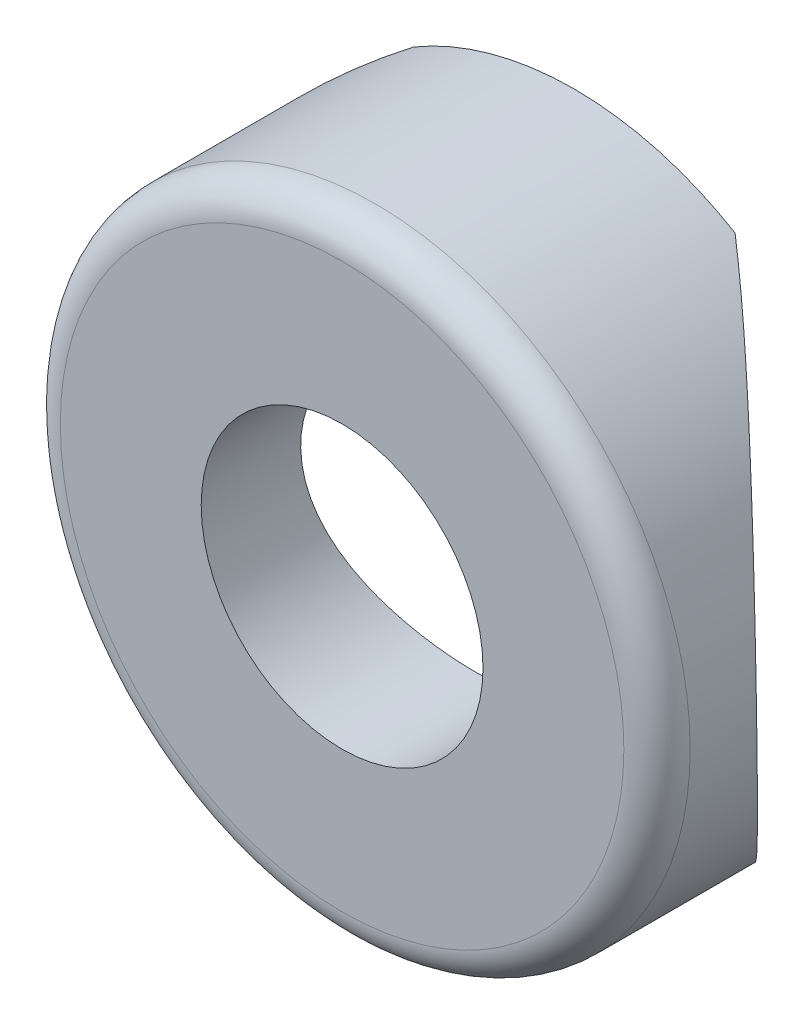
ISO-10303-21;
HEADER;
FILE_DESCRIPTION(('STEP AP214'),'2;1');
FILE_NAME('part.step','',(''),(''),'','','');
FILE_SCHEMA(('AUTOMOTIVE_DESIGN { 1 0 10303 214 1 1 1 1 }'));
ENDSEC;
DATA;
#1=APPLICATION_CONTEXT('core data for automotive mechanical design processes');
#2=APPLICATION_PROTOCOL_DEFINITION('international standard','automotive_design',2000,#1);
#3=PRODUCT_CONTEXT('',#1,'mechanical');
#4=PRODUCT('Part','Part','',(#3));
#5=PRODUCT_RELATED_PRODUCT_CATEGORY('part','',(#4));
#6=PRODUCT_DEFINITION_FORMATION('','',#4);
#7=PRODUCT_DEFINITION_CONTEXT('part definition',#1,'design');
#8=PRODUCT_DEFINITION('design','',#6,#7);
#9=PRODUCT_DEFINITION_SHAPE('','',#8);
#10=(LENGTH_UNIT() NAMED_UNIT(*) SI_UNIT(.MILLI.,.METRE.));
#11=(NAMED_UNIT(*) PLANE_ANGLE_UNIT() SI_UNIT($,.RADIAN.));
#12=(NAMED_UNIT(*) SI_UNIT($,.STERADIAN.) SOLID_ANGLE_UNIT());
#13=UNCERTAINTY_MEASURE_WITH_UNIT(LENGTH_MEASURE(1.E-05),#10,'distance_accuracy_value','');
#14=(GEOMETRIC_REPRESENTATION_CONTEXT(3) GLOBAL_UNCERTAINTY_ASSIGNED_CONTEXT((#13)) GLOBAL_UNIT_ASSIGNED_CONTEXT((#10,
#11,#12)) REPRESENTATION_CONTEXT('',''));
#15=CARTESIAN_POINT('',(0.,0.,0.));
#16=DIRECTION('',(0.,0.,1.));
#17=DIRECTION('',(1.,0.,0.));
#18=AXIS2_PLACEMENT_3D('',#15,#16,#17);
#19=CARTESIAN_POINT('',(0.,0.,0.));
#20=DIRECTION('',(0.,0.,1.));
#21=DIRECTION('',(1.,0.,0.));
#22=AXIS2_PLACEMENT_3D('',#19,#20,#21);
#23=PLANE('',#22);
#24=CARTESIAN_POINT('',(0.,0.,0.));
#25=DIRECTION('',(0.,0.,1.));
#26=DIRECTION('',(1.,0.,0.));
#27=AXIS2_PLACEMENT_3D('',#24,#25,#26);
#28=CIRCLE('',#27,9.5);
#29=CARTESIAN_POINT('',(-5.37406470080677,-7.83386421834988,0.));
#30=VERTEX_POINT('',#29);
#31=CARTESIAN_POINT('',(5.37406470080677,-7.83386421834988,0.));
#32=VERTEX_POINT('',#31);
#33=EDGE_CURVE('E74',#30,#32,#28,.T.);
#34=ORIENTED_EDGE('',*,*,#33,.F.);
#35=DIRECTION('',(1.,0.,0.));
#36=VECTOR('',#35,1.);
#37=CARTESIAN_POINT('',(-9.5,-7.83386421834988,0.));
#38=LINE('',#37,#36);
#39=EDGE_CURVE('E65',#30,#32,#38,.T.);
#40=ORIENTED_EDGE('',*,*,#39,.T.);
#41=EDGE_LOOP('',(#34,#40));
#42=FACE_BOUND('',#41,.T.);
#43=ADVANCED_FACE('F34',(#42),#23,.F.);
#44=CARTESIAN_POINT('',(0.,0.,7.));
#45=DIRECTION('',(0.,0.,1.));
#46=DIRECTION('',(1.,0.,0.));
#47=AXIS2_PLACEMENT_3D('',#44,#45,#46);
#48=PLANE('',#47);
#49=CARTESIAN_POINT('',(0.,0.,7.));
#50=DIRECTION('',(0.,0.,1.));
#51=DIRECTION('',(1.,0.,0.));
#52=AXIS2_PLACEMENT_3D('',#49,#50,#51);
#53=CIRCLE('',#52,8.5);
#54=CARTESIAN_POINT('',(8.5,0.,7.));
#55=VERTEX_POINT('',#54);
#56=EDGE_CURVE('E42',#55,#55,#53,.T.);
#57=ORIENTED_EDGE('',*,*,#56,.T.);
#58=EDGE_LOOP('',(#57));
#59=FACE_BOUND('',#58,.T.);
#60=CARTESIAN_POINT('',(0.,0.,7.));
#61=DIRECTION('',(0.,0.,1.));
#62=DIRECTION('',(1.,0.,0.));
#63=AXIS2_PLACEMENT_3D('',#60,#61,#62);
#64=CIRCLE('',#63,4.25);
#65=CARTESIAN_POINT('',(4.25,0.,7.));
#66=VERTEX_POINT('',#65);
#67=EDGE_CURVE('E77',#66,#66,#64,.T.);
#68=ORIENTED_EDGE('',*,*,#67,.F.);
#69=EDGE_LOOP('',(#68));
#70=FACE_BOUND('',#69,.T.);
#71=ADVANCED_FACE('F111',(#59,#70),#48,.T.);
#72=CARTESIAN_POINT('',(4.85429978427926,8.16613578165012,0.));
#73=VERTEX_POINT('',#72);
#74=CARTESIAN_POINT('',(-4.85429978427926,8.16613578165012,0.));
#75=VERTEX_POINT('',#74);
#76=EDGE_CURVE('E71',#73,#75,#28,.T.);
#77=ORIENTED_EDGE('',*,*,#76,.F.);
#78=DIRECTION('',(1.,0.,0.));
#79=VECTOR('',#78,1.);
#80=CARTESIAN_POINT('',(-9.5,8.16613578165012,0.));
#81=LINE('',#80,#79);
#82=EDGE_CURVE('E63',#73,#75,#81,.F.);
#83=ORIENTED_EDGE('',*,*,#82,.T.);
#84=EDGE_LOOP('',(#77,#83));
#85=FACE_BOUND('',#84,.T.);
#86=ADVANCED_FACE('F70',(#85),#23,.F.);
#87=CARTESIAN_POINT('',(0.,0.,7.));
#88=DIRECTION('',(0.,0.,-1.));
#89=DIRECTION('',(-1.,0.,0.));
#90=AXIS2_PLACEMENT_3D('',#87,#88,#89);
#91=CYLINDRICAL_SURFACE('',#90,9.5);
#92=CARTESIAN_POINT('',(0.,0.,6.));
#93=DIRECTION('',(0.,0.,1.));
#94=DIRECTION('',(1.,0.,0.));
#95=AXIS2_PLACEMENT_3D('',#92,#93,#94);
#96=CIRCLE('',#95,9.5);
#97=CARTESIAN_POINT('',(9.5,0.,6.));
#98=VERTEX_POINT('',#97);
#99=EDGE_CURVE('E11',#98,#98,#96,.F.);
#100=ORIENTED_EDGE('',*,*,#99,.T.);
#101=EDGE_LOOP('',(#100));
#102=FACE_BOUND('',#101,.T.);
#103=ORIENTED_EDGE('',*,*,#33,.T.);
#104=CARTESIAN_POINT('',(5.37406470080677,-7.83386421834988,0.));
#105=CARTESIAN_POINT('',(5.48416025966032,-7.75833258075973,0.100707768938598));
#106=CARTESIAN_POINT('',(5.59300855918341,-7.68025448611933,0.200850852929993));
#107=CARTESIAN_POINT('',(5.80812272830394,-7.51889698266739,0.399740347544008));
#108=CARTESIAN_POINT('',(5.91438830288451,-7.43561698350076,0.498486598077082));
#109=CARTESIAN_POINT('',(6.2295053225158,-7.17754046700573,0.792533972530058));
#110=CARTESIAN_POINT('',(6.43429494573915,-6.99476837524206,0.985292893674646));
#111=CARTESIAN_POINT('',(6.83360398264913,-6.60533703419469,1.3635356635619));
#112=CARTESIAN_POINT('',(7.02798880680612,-6.39844141453628,1.54891862579473));
#113=CARTESIAN_POINT('',(7.40184726487358,-5.96197245683274,1.90733372056811));
#114=CARTESIAN_POINT('',(7.58133304657986,-5.73241793459479,2.08037589850801));
#115=CARTESIAN_POINT('',(7.87522566467541,-5.31753947531898,2.36503326906078));
#116=CARTESIAN_POINT('',(7.99383497894471,-5.13770373275049,2.48033364786691));
#117=CARTESIAN_POINT('',(8.22073581945569,-4.76621942095872,2.7016428893997));
#118=CARTESIAN_POINT('',(8.32903011636578,-4.57457404677312,2.80765424659077));
#119=CARTESIAN_POINT('',(8.53361354488572,-4.18049588026674,3.00863676191639));
#120=CARTESIAN_POINT('',(8.62994533940689,-3.97810532708245,3.10364706699307));
#121=CARTESIAN_POINT('',(8.80963030600415,-3.56253133818057,3.28160017187122));
#122=CARTESIAN_POINT('',(8.89298568531445,-3.34934974616649,3.36454502379825));
#123=CARTESIAN_POINT('',(9.03347826379114,-2.94693186831068,3.50510135218699));
#124=CARTESIAN_POINT('',(9.09267650478677,-2.75908906115812,3.56464688930527));
#125=CARTESIAN_POINT('',(9.19988415359906,-2.37727390944098,3.67318137537323));
#126=CARTESIAN_POINT('',(9.24789569360446,-2.18330274096085,3.72217233589414));
#127=CARTESIAN_POINT('',(9.331957915393,-1.79023974795908,3.80882777685082));
#128=CARTESIAN_POINT('',(9.36800588134845,-1.59114677178331,3.84648968531909));
#129=CARTESIAN_POINT('',(9.42746579693772,-1.18918493337948,3.90981819072717));
#130=CARTESIAN_POINT('',(9.45087762576409,-0.986316035070978,3.93548467298471));
#131=CARTESIAN_POINT('',(9.48464680727328,-0.577626060441932,3.97442176057754));
#132=CARTESIAN_POINT('',(9.494960895772,-0.371797459797559,3.98765124711513));
#133=CARTESIAN_POINT('',(9.50215088334912,0.0405210622377658,4.0013383247376));
#134=CARTESIAN_POINT('',(9.4990267656953,0.247010984451826,4.00179589991985));
#135=CARTESIAN_POINT('',(9.47936040630255,0.658980379661391,3.98997354640475));
#136=CARTESIAN_POINT('',(9.46281813912228,0.864459850740298,3.97769359355652));
#137=CARTESIAN_POINT('',(9.41659263590326,1.27279277538336,3.94069096350258));
#138=CARTESIAN_POINT('',(9.38690961616833,1.47564627211588,3.91596849110648));
#139=CARTESIAN_POINT('',(9.31689150878508,1.8662017204079,3.85629928781322));
#140=CARTESIAN_POINT('',(9.27723181527116,2.05412350924323,3.82198943411379));
#141=CARTESIAN_POINT('',(9.18718735319847,2.42529886181182,3.74331506607258));
#142=CARTESIAN_POINT('',(9.13679851648875,2.6085506252262,3.69894673746194));
#143=CARTESIAN_POINT('',(9.02599959326466,2.96933112618789,3.60088677965378));
#144=CARTESIAN_POINT('',(8.96559408277854,3.14686243304591,3.54719940725701));
#145=CARTESIAN_POINT('',(8.83546190573579,3.4956074163516,3.43124619813154));
#146=CARTESIAN_POINT('',(8.7657333912113,3.66681983168682,3.36897866060242));
#147=CARTESIAN_POINT('',(8.59037091494982,4.06429967271915,3.2122339757602));
#148=CARTESIAN_POINT('',(8.4809802866556,4.28757847551632,3.1143482484017));
#149=CARTESIAN_POINT('',(8.24792875364915,4.72039590007387,2.90597862825495));
#150=CARTESIAN_POINT('',(8.1242632220306,4.92993003208443,2.79549065085403));
#151=CARTESIAN_POINT('',(7.86384635684162,5.33556328160391,2.56340062893353));
#152=CARTESIAN_POINT('',(7.72704592494771,5.53160688434875,2.44175696689131));
#153=CARTESIAN_POINT('',(7.44225961715427,5.90920468517908,2.18954902298519));
#154=CARTESIAN_POINT('',(7.2942746400176,6.09076004509924,2.05898545798383));
#155=CARTESIAN_POINT('',(6.97138492294432,6.45880640983866,1.77573265832523));
#156=CARTESIAN_POINT('',(6.79531372286872,6.6436184566576,1.62219419148652));
#157=CARTESIAN_POINT('',(6.43213280926493,6.99583381482852,1.30827605055813));
#158=CARTESIAN_POINT('',(6.24501969216692,7.16323171403512,1.14789427134358));
#159=CARTESIAN_POINT('',(5.86263505861733,7.47933304600508,0.824060295729446));
#160=CARTESIAN_POINT('',(5.66746582737835,7.62820923836274,0.660655893146932));
#161=CARTESIAN_POINT('',(5.36773459367195,7.83915375518186,0.413774698429941));
#162=CARTESIAN_POINT('',(5.26669955027822,7.90738424647862,0.331215752010466));
#163=CARTESIAN_POINT('',(5.06227250692949,8.03978905304443,0.165777637241081));
#164=CARTESIAN_POINT('',(4.95888063435549,8.1039635868244,0.0828984863975882));
#165=CARTESIAN_POINT('',(4.85429978427926,8.16613578165011,0.));
#166=B_SPLINE_CURVE_WITH_KNOTS('',3,(#104,#105,#106,#107,#108,#109,#110,#111,#112,#113,#114,
#115,#116,#117,#118,#119,#120,#121,#122,#123,#124,#125,#126,#127,#128,#129,#130,#131,#132,#133,
#134,#135,#136,#137,#138,#139,#140,#141,#142,#143,#144,#145,#146,#147,#148,#149,#150,#151,#152,
#153,#154,#155,#156,#157,#158,#159,#160,#161,#162,#163,#164,#165),.UNSPECIFIED.,.F.,.F.,(4,2,2,
2,2,2,2,2,2,2,2,2,2,2,2,2,2,2,2,2,2,2,2,2,2,2,2,2,2,2,4),(0.,0.501659117908931,1.00337527204414,
2.0085454895318,3.02455680752767,4.03973142257645,4.77215991349469,5.50439111213943,
6.23393093580191,6.96334653187114,7.57999211874464,8.19652007645361,8.81318789539664,
9.42986160987177,10.0485670542578,10.667273269009,11.2859806568545,11.9046778608234,
12.489358310187,13.0742608478791,13.6588969105073,14.2436490295873,15.0441046871429,
15.8448205277877,16.6486555039195,17.4524259543651,18.3451844051551,19.2382194927122,
20.1221752956956,20.5638299242153,21.0054607386889),.UNSPECIFIED.);
#167=EDGE_CURVE('E56',#32,#73,#166,.T.);
#168=ORIENTED_EDGE('',*,*,#167,.T.);
#169=ORIENTED_EDGE('',*,*,#76,.T.);
#170=CARTESIAN_POINT('',(-4.85429978427926,8.16613578165012,0.));
#171=CARTESIAN_POINT('',(-4.99716028092233,8.08119689587627,0.113262152570471));
#172=CARTESIAN_POINT('',(-5.13783524955567,7.99251529244081,0.226483447955166));
#173=CARTESIAN_POINT('',(-5.41479834982224,7.80754559852536,0.452140031447955));
#174=CARTESIAN_POINT('',(-5.5510856564395,7.71125608914589,0.564575168658569));
#175=CARTESIAN_POINT('',(-5.81966521412036,7.51063685530416,0.788296262582284));
#176=CARTESIAN_POINT('',(-5.95194211515951,7.40628062053333,0.899576937837848));
#177=CARTESIAN_POINT('',(-6.21180532030484,7.18972048688151,1.11991019599379));
#178=CARTESIAN_POINT('',(-6.33939186711171,7.07751699492846,1.22896289404994));
#179=CARTESIAN_POINT('',(-6.71763660390107,6.72627092194442,1.55428671212167));
#180=CARTESIAN_POINT('',(-6.96075660168258,6.47483471144215,1.76618480299554));
#181=CARTESIAN_POINT('',(-7.4232661982467,5.93886291688779,2.17242067871832));
#182=CARTESIAN_POINT('',(-7.6426938940553,5.65438204516453,2.3667865697811));
#183=CARTESIAN_POINT('',(-7.96636889370197,5.1798699577443,2.65468964211951));
#184=CARTESIAN_POINT('',(-8.08001510065399,5.00091369365817,2.75604512659845));
#185=CARTESIAN_POINT('',(-8.29693407604724,4.63213025237828,2.94976276485854));
#186=CARTESIAN_POINT('',(-8.40020754823808,4.44230381405738,3.0421255287477));
#187=CARTESIAN_POINT('',(-8.59483656786312,4.0528993093056,3.21620267853192));
#188=CARTESIAN_POINT('',(-8.68623282120032,3.85335795472511,3.29795343304623));
#189=CARTESIAN_POINT('',(-8.85626176796399,3.44464749851597,3.44980780346049));
#190=CARTESIAN_POINT('',(-8.93489680814146,3.23548017617746,3.5199135608984));
#191=CARTESIAN_POINT('',(-9.07895186464732,2.80614725931412,3.64785264867542));
#192=CARTESIAN_POINT('',(-9.14421434840034,2.58588486539375,3.70554004772568));
#193=CARTESIAN_POINT('',(-9.25916819870639,2.13804473026727,3.80633684115433));
#194=CARTESIAN_POINT('',(-9.30885943294922,1.91046692691964,3.8494461116614));
#195=CARTESIAN_POINT('',(-9.39161281929353,1.44994042138688,3.91998467607452));
#196=CARTESIAN_POINT('',(-9.42467789823016,1.21699267207279,3.94741672988266));
#197=CARTESIAN_POINT('',(-9.47344342239587,0.747952762124183,3.98583127539991));
#198=CARTESIAN_POINT('',(-9.48914663039786,0.511861107828369,3.99681638438945));
#199=CARTESIAN_POINT('',(-9.50190971147495,0.0719670921098915,4.00162841609005));
#200=CARTESIAN_POINT('',(-9.50126229119137,-0.131750984069243,3.99763271172557));
#201=CARTESIAN_POINT('',(-9.48692654969389,-0.538088209752966,3.97724586195396));
#202=CARTESIAN_POINT('',(-9.47323965498384,-0.740707477027533,3.96085607248626));
#203=CARTESIAN_POINT('',(-9.43312303054145,-1.14329093349398,3.91596830683871));
#204=CARTESIAN_POINT('',(-9.4066946706566,-1.34325540573134,3.88747163232112));
#205=CARTESIAN_POINT('',(-9.34160510877186,-1.73915523871154,3.8188711389899));
#206=CARTESIAN_POINT('',(-9.30294353769822,-1.93509047770317,3.77876696998339));
#207=CARTESIAN_POINT('',(-9.21542714314541,-2.31578985761977,3.68902065599279));
#208=CARTESIAN_POINT('',(-9.16692033720939,-2.50071237455626,3.63970783226922));
#209=CARTESIAN_POINT('',(-9.05974831946684,-2.86478384556464,3.53150606499537));
#210=CARTESIAN_POINT('',(-9.00107929824612,-3.04393060455434,3.472613530895));
#211=CARTESIAN_POINT('',(-8.87437359687299,-3.39564886917342,3.34604831178781));
#212=CARTESIAN_POINT('',(-8.80633795857372,-3.5682211033684,3.27837660334081));
#213=CARTESIAN_POINT('',(-8.66167145312908,-3.90631213952178,3.1350369510433));
#214=CARTESIAN_POINT('',(-8.58503878944997,-4.0718294571939,3.05936733604968));
#215=CARTESIAN_POINT('',(-8.38759952914599,-4.46843884288031,2.86504691667359));
#216=CARTESIAN_POINT('',(-8.2624581737898,-4.6954369749701,2.74240340265179));
#217=CARTESIAN_POINT('',(-7.99786102928072,-5.13319565932235,2.48420467709384));
#218=CARTESIAN_POINT('',(-7.85839924346163,-5.34394934403678,2.34864405825846));
#219=CARTESIAN_POINT('',(-7.5667393521751,-5.74952169492672,2.06636146540025));
#220=CARTESIAN_POINT('',(-7.41450942739039,-5.94429800461885,1.91961169500076));
#221=CARTESIAN_POINT('',(-7.09933008894088,-6.317368378476,1.61720673723128));
#222=CARTESIAN_POINT('',(-6.93638325309398,-6.49566638165177,1.46155369259695));
#223=CARTESIAN_POINT('',(-6.55000261287526,-6.88800617738478,1.09447242584369));
#224=CARTESIAN_POINT('',(-6.32325121513007,-7.09641475405927,0.880485014031592));
#225=CARTESIAN_POINT('',(-5.97368208882344,-7.38836678225433,0.553674400801009));
#226=CARTESIAN_POINT('',(-5.8560019692304,-7.48195665972071,0.444148704760443));
#227=CARTESIAN_POINT('',(-5.61741760115232,-7.66270059504381,0.223316486218034));
#228=CARTESIAN_POINT('',(-5.49651341913763,-7.7498547854454,0.112010000449555));
#229=CARTESIAN_POINT('',(-5.37406470080677,-7.83386421834988,0.));
#230=B_SPLINE_CURVE_WITH_KNOTS('',3,(#170,#171,#172,#173,#174,#175,#176,#177,#178,#179,#180,
#181,#182,#183,#184,#185,#186,#187,#188,#189,#190,#191,#192,#193,#194,#195,#196,#197,#198,#199,
#200,#201,#202,#203,#204,#205,#206,#207,#208,#209,#210,#211,#212,#213,#214,#215,#216,#217,#218,
#219,#220,#221,#222,#223,#224,#225,#226,#227,#228,#229),.UNSPECIFIED.,.F.,.F.,(4,2,2,2,2,2,2,2,
2,2,2,2,2,2,2,2,2,2,2,2,2,2,2,2,2,2,2,2,2,4),(0.,0.603340854853789,1.20679450158459,
1.81232332709815,2.41782077551375,3.64237968621395,4.8649392333791,5.56931037736789,
6.27363370019261,6.97547563934675,7.67718836513968,8.38674435647164,9.09630637679621,
9.80574344347233,10.5150676020557,11.1255628789586,11.7359913760323,12.3463542599655,
12.9567355601917,13.5484439131996,14.1403745562966,14.7322394117902,15.3242281814044,
16.1832163331839,17.0425656637478,17.9041241017115,18.7654760552611,19.8889365220146,
20.4468795806428,21.0048111450626),.UNSPECIFIED.);
#231=EDGE_CURVE('E49',#75,#30,#230,.T.);
#232=ORIENTED_EDGE('',*,*,#231,.T.);
#233=EDGE_LOOP('',(#103,#168,#169,#232));
#234=FACE_BOUND('',#233,.T.);
#235=ADVANCED_FACE('F73',(#102,#234),#91,.T.);
#236=CARTESIAN_POINT('',(0.,0.,7.));
#237=DIRECTION('',(0.,0.,-1.));
#238=DIRECTION('',(-1.,0.,0.));
#239=AXIS2_PLACEMENT_3D('',#236,#237,#238);
#240=CYLINDRICAL_SURFACE('',#239,4.25);
#241=CARTESIAN_POINT('',(-4.25,0.,3.99861984986206));
#242=CARTESIAN_POINT('',(-4.24999915314703,-0.114122649407347,3.99672292458213));
#243=CARTESIAN_POINT('',(-4.24539678187837,-0.228250328002596,3.99286737217869));
#244=CARTESIAN_POINT('',(-4.22704805753415,-0.45561987792098,3.98130234582407));
#245=CARTESIAN_POINT('',(-4.21329594839702,-0.568861146206013,3.97359044662051));
#246=CARTESIAN_POINT('',(-4.17676516981349,-0.793810662435078,3.95445930748774));
#247=CARTESIAN_POINT('',(-4.1539679816909,-0.905515275747254,3.94303247040737));
#248=CARTESIAN_POINT('',(-4.09960321272,-1.12637117715319,3.91674489245537));
#249=CARTESIAN_POINT('',(-4.06803201983413,-1.23552139355845,3.90188273777466));
#250=CARTESIAN_POINT('',(-3.96088600183712,-1.55714566300838,3.8527672629809));
#251=CARTESIAN_POINT('',(-3.87270092326599,-1.76486873106021,3.81388873458445));
#252=CARTESIAN_POINT('',(-3.66576563068943,-2.1621558369263,3.72730867972909));
#253=CARTESIAN_POINT('',(-3.54702435951079,-2.35172516552735,3.679609735873));
#254=CARTESIAN_POINT('',(-3.27542296662096,-2.71821945338778,3.57697735626335));
#255=CARTESIAN_POINT('',(-3.12114363755285,-2.8940238225312,3.52180032943431));
#256=CARTESIAN_POINT('',(-2.78570934733799,-3.21818427145496,3.4114688548463));
#257=CARTESIAN_POINT('',(-2.60453895373111,-3.36652447929354,3.35631443840987));
#258=CARTESIAN_POINT('',(-2.31079874171042,-3.56901364140944,3.27654584806816));
#259=CARTESIAN_POINT('',(-2.20642216913164,-3.6344783886253,3.24984858587378));
#260=CARTESIAN_POINT('',(-1.99194772128211,-3.75630575643153,3.19884813047023));
#261=CARTESIAN_POINT('',(-1.88185227453388,-3.81267219952324,3.17454393353698));
#262=CARTESIAN_POINT('',(-1.6566210039803,-3.91579510373278,3.12913025885915));
#263=CARTESIAN_POINT('',(-1.54148536670489,-3.96255192012446,3.1080206630158));
#264=CARTESIAN_POINT('',(-1.30702510481802,-4.04594282631289,3.06975745668527));
#265=CARTESIAN_POINT('',(-1.18770278292375,-4.08258238530412,3.05260170965631));
#266=CARTESIAN_POINT('',(-0.952599352974802,-4.14354407596464,3.02373163012697));
#267=CARTESIAN_POINT('',(-0.836999486373446,-4.16844551938283,3.01176447760978));
#268=CARTESIAN_POINT('',(-0.603804363973669,-4.20855181082663,2.99236380856862));
#269=CARTESIAN_POINT('',(-0.486210093435666,-4.22376131133524,2.98492811685455));
#270=CARTESIAN_POINT('',(-0.249992106573012,-4.2442966904898,2.97486585592127));
#271=CARTESIAN_POINT('',(-0.131368722631716,-4.24962564909938,2.97223778807242));
#272=CARTESIAN_POINT('',(0.105909753652383,-4.25033622380975,2.97188806228274));
#273=CARTESIAN_POINT('',(0.224564843702762,-4.24571842867748,2.97416611393953));
#274=CARTESIAN_POINT('',(0.450638957217714,-4.22742772225141,2.98313379492893));
#275=CARTESIAN_POINT('',(0.558140810401016,-4.2145739883985,2.98942411536621));
#276=CARTESIAN_POINT('',(0.771579882341277,-4.18077251372939,3.00581644707739));
#277=CARTESIAN_POINT('',(0.877516583251361,-4.15982215368332,3.01591969179394));
#278=CARTESIAN_POINT('',(1.19186277581549,-4.08512512026666,3.05151397178109));
#279=CARTESIAN_POINT('',(1.39698833432468,-4.01951754873057,3.08229746546003));
#280=CARTESIAN_POINT('',(1.7981099722403,-3.85711744591806,3.15540671435368));
#281=CARTESIAN_POINT('',(1.99376002171657,-3.75960138594474,3.19799637471817));
#282=CARTESIAN_POINT('',(2.36675684381239,-3.53669169176084,3.28997272697164));
#283=CARTESIAN_POINT('',(2.54409595149675,-3.41128645189586,3.33936224524839));
#284=CARTESIAN_POINT('',(2.8932617327842,-3.12213297041977,3.44527180012201));
#285=CARTESIAN_POINT('',(3.06293604429409,-2.95586358499824,3.50202185483089));
#286=CARTESIAN_POINT('',(3.3727341636266,-2.59680685187868,3.61256570680775));
#287=CARTESIAN_POINT('',(3.51284905631448,-2.40401153282978,3.66635860859028));
#288=CARTESIAN_POINT('',(3.76345357717372,-1.98978761625294,3.76722811229538));
#289=CARTESIAN_POINT('',(3.87290197032895,-1.76766182424288,3.81404790774932));
#290=CARTESIAN_POINT('',(4.05205604459615,-1.30561664748966,3.89387509621613));
#291=CARTESIAN_POINT('',(4.12178476646354,-1.06570766996558,3.92689049397986));
#292=CARTESIAN_POINT('',(4.21506447882252,-0.59176372914569,3.9738929168069));
#293=CARTESIAN_POINT('',(4.24134531970749,-0.358376300942645,3.98898638753237));
#294=CARTESIAN_POINT('',(4.25502462043621,0.109985736629891,4.00258262389563));
#295=CARTESIAN_POINT('',(4.2424363279469,0.344959777999142,4.00109104172367));
#296=CARTESIAN_POINT('',(4.18069940299619,0.795635346412501,3.98257172907814));
#297=CARTESIAN_POINT('',(4.13367996936294,1.01167111073697,3.9664362074919));
#298=CARTESIAN_POINT('',(4.0072778667503,1.43267041904365,3.92173013502796));
#299=CARTESIAN_POINT('',(3.92789173742506,1.63763277650603,3.89315825454845));
#300=CARTESIAN_POINT('',(3.73688205674308,2.03677552130483,3.82561835966173));
#301=CARTESIAN_POINT('',(3.62447120260348,2.23053488851751,3.78639847446151));
#302=CARTESIAN_POINT('',(3.37145064905123,2.59720552180894,3.70182258058993));
#303=CARTESIAN_POINT('',(3.23082961848616,2.77010836563858,3.65646410862858));
#304=CARTESIAN_POINT('',(2.91365691123305,3.10318223487968,3.56064426006439));
#305=CARTESIAN_POINT('',(2.73525148504775,3.26155046808453,3.5100502272214));
#306=CARTESIAN_POINT('',(2.35366094903819,3.5467510966966,3.41245054505285));
#307=CARTESIAN_POINT('',(2.15046947628919,3.67357536882734,3.3654458222102));
#308=CARTESIAN_POINT('',(1.82883312162942,3.83833541140682,3.30153250752586));
#309=CARTESIAN_POINT('',(1.71761649194744,3.88938599748062,3.28115815282681));
#310=CARTESIAN_POINT('',(1.49075375053765,3.98185027178619,3.24352838062297));
#311=CARTESIAN_POINT('',(1.37510957180899,4.02326811089025,3.2262716204256));
#312=CARTESIAN_POINT('',(1.14026213356767,4.09602404926069,3.19551738667849));
#313=CARTESIAN_POINT('',(1.02106039788367,4.12736639837845,3.18201832844942));
#314=CARTESIAN_POINT('',(0.779993486393016,4.17963094765415,3.15929429340431));
#315=CARTESIAN_POINT('',(0.658128549184363,4.20055407731424,3.15006893533512));
#316=CARTESIAN_POINT('',(0.421653215141536,4.23058764669188,3.13676523428824));
#317=CARTESIAN_POINT('',(0.307155046473191,4.24044252508435,3.1323630931571));
#318=CARTESIAN_POINT('',(0.0776099794601125,4.25084453137415,3.12771538937393));
#319=CARTESIAN_POINT('',(-0.0374370904471517,4.25138852846948,3.12747122484979));
#320=CARTESIAN_POINT('',(-0.267066991295066,4.24315544206945,3.13115164629523));
#321=CARTESIAN_POINT('',(-0.381650037196118,4.23438333214019,3.13507400789248));
#322=CARTESIAN_POINT('',(-0.609564889374284,4.20762430658358,3.14694395491582));
#323=CARTESIAN_POINT('',(-0.722896208848811,4.18963392648484,3.15489305368416));
#324=CARTESIAN_POINT('',(-0.942121957474519,4.14569713655161,3.1740741873457));
#325=CARTESIAN_POINT('',(-1.04811496802553,4.12016620004916,3.18513361304523));
#326=CARTESIAN_POINT('',(-1.25750740873709,4.06116043236729,3.2103096955383));
#327=CARTESIAN_POINT('',(-1.36090592889089,4.02768285583846,3.22442740873989));
#328=CARTESIAN_POINT('',(-1.66623943853617,3.91574559780392,3.2707603254107));
#329=CARTESIAN_POINT('',(-1.86346797007286,3.8257498339022,3.30696986707355));
#330=CARTESIAN_POINT('',(-2.25166231751284,3.61171352827442,3.38838468454455));
#331=CARTESIAN_POINT('',(-2.44162658319969,3.48602170728352,3.43398571127224));
#332=CARTESIAN_POINT('',(-2.79876898480695,3.2063810240686,3.52778455253428));
#333=CARTESIAN_POINT('',(-2.96593939265835,3.05242261960132,3.57598324009451));
#334=CARTESIAN_POINT('',(-3.28472196447308,2.70773932455172,3.67338375455651));
#335=CARTESIAN_POINT('',(-3.43445039949025,2.51520482231647,3.72242322815102));
#336=CARTESIAN_POINT('',(-3.63318018501697,2.20848866846063,3.7897827419397));
#337=CARTESIAN_POINT('',(-3.69515235741125,2.10317233379005,3.81121736100064));
#338=CARTESIAN_POINT('',(-3.8099713450305,1.88720587315699,3.85139324420863));
#339=CARTESIAN_POINT('',(-3.86282240177089,1.77655825714286,3.87013575955816));
#340=CARTESIAN_POINT('',(-3.95799360394949,1.55283240770108,3.90402115164536));
#341=CARTESIAN_POINT('',(-4.00049509012889,1.43984055901506,3.91922576817089));
#342=CARTESIAN_POINT('',(-4.0758115535257,1.21030490978606,3.94600668875321));
#343=CARTESIAN_POINT('',(-4.108631130306,1.0937628249719,3.95758471584771));
#344=CARTESIAN_POINT('',(-4.1641873529985,0.858280825352776,3.9767158350503));
#345=CARTESIAN_POINT('',(-4.18694838913912,0.73934745009716,3.98427867237865));
#346=CARTESIAN_POINT('',(-4.22223803287359,0.499839275018036,3.99514836928226));
#347=CARTESIAN_POINT('',(-4.23477398219375,0.379265716218888,3.99845828348784));
#348=CARTESIAN_POINT('',(-4.2447579059868,0.215385362713195,3.99997155352236));
#349=CARTESIAN_POINT('',(-4.24672334421445,0.172331050503791,4.0000908580874));
#350=CARTESIAN_POINT('',(-4.24934454573967,0.0861847310119699,3.99977314356679));
#351=CARTESIAN_POINT('',(-4.25000031977177,0.0430927240414097,3.99933612904099));
#352=CARTESIAN_POINT('',(-4.25,0.,3.99861984986206));
#353=B_SPLINE_CURVE_WITH_KNOTS('',3,(#241,#242,#243,#244,#245,#246,#247,#248,#249,#250,#251,
#252,#253,#254,#255,#256,#257,#258,#259,#260,#261,#262,#263,#264,#265,#266,#267,#268,#269,#270,
#271,#272,#273,#274,#275,#276,#277,#278,#279,#280,#281,#282,#283,#284,#285,#286,#287,#288,#289,
#290,#291,#292,#293,#294,#295,#296,#297,#298,#299,#300,#301,#302,#303,#304,#305,#306,#307,#308,
#309,#310,#311,#312,#313,#314,#315,#316,#317,#318,#319,#320,#321,#322,#323,#324,#325,#326,#327,
#328,#329,#330,#331,#332,#333,#334,#335,#336,#337,#338,#339,#340,#341,#342,#343,#344,#345,#346,
#347,#348,#349,#350,#351,#352),.UNSPECIFIED.,.T.,.F.,(4,2,2,2,2,2,2,2,2,2,2,2,2,2,2,2,2,2,2,2,2,
2,2,2,2,2,2,2,2,2,2,2,2,2,2,2,2,2,2,2,2,2,2,2,2,2,2,2,2,2,2,2,2,2,2,4),(0.,0.342371000428033,
0.684957588921375,1.02824923055404,1.37168240662162,2.05530753283801,2.73873281079629,
3.45664096694587,4.17496272645322,4.55276321183712,4.93040455514245,5.30803193430117,
5.68545477393837,6.04153753938016,6.39744924319732,6.75324998351333,7.10902966389779,
7.43398536006914,7.75904626636823,8.40863246048107,9.074107464185,9.73985991501268,
10.4693360737064,11.1990319292144,11.95112338711,12.7027781231536,13.4051109309302,
14.107204390845,14.769197959264,15.43126232044,16.1106062007109,16.790223500663,
17.5185883080915,18.2471404920151,18.6189072487427,18.9905135084319,19.3619628179472,
19.7333789844022,20.0779522243635,20.4226413254739,20.7671465007611,21.1117812453346,
21.4401539050176,21.7686401741139,22.4251399596858,23.119146478772,23.813387713042,
24.5557884017033,24.9275869773456,25.2992121900229,25.6637620146559,26.0281383734945,
26.391626268296,26.7548529444228,26.8841333286971,27.0134126533347),.UNSPECIFIED.);
#354=CARTESIAN_POINT('',(-4.25,0.,3.99861984986206));
#355=VERTEX_POINT('',#354);
#356=EDGE_CURVE('E67',#355,#355,#353,.T.);
#357=ORIENTED_EDGE('',*,*,#356,.F.);
#358=EDGE_LOOP('',(#357));
#359=FACE_BOUND('',#358,.T.);
#360=ORIENTED_EDGE('',*,*,#67,.T.);
#361=EDGE_LOOP('',(#360));
#362=FACE_BOUND('',#361,.T.);
#363=ADVANCED_FACE('F87',(#359,#362),#240,.F.);
#364=CARTESIAN_POINT('',(-9.5,0.166135781650116,-6.));
#365=DIRECTION('',(1.,0.,0.));
#366=DIRECTION('',(0.,0.,-1.));
#367=AXIS2_PLACEMENT_3D('',#364,#365,#366);
#368=CYLINDRICAL_SURFACE('',#367,10.);
#369=ORIENTED_EDGE('',*,*,#356,.T.);
#370=EDGE_LOOP('',(#369));
#371=FACE_BOUND('',#370,.T.);
#372=ORIENTED_EDGE('',*,*,#39,.F.);
#373=ORIENTED_EDGE('',*,*,#231,.F.);
#374=ORIENTED_EDGE('',*,*,#82,.F.);
#375=ORIENTED_EDGE('',*,*,#167,.F.);
#376=EDGE_LOOP('',(#372,#373,#374,#375));
#377=FACE_BOUND('',#376,.T.);
#378=ADVANCED_FACE('F62',(#371,#377),#368,.F.);
#379=CARTESIAN_POINT('',(0.,0.,6.));
#380=DIRECTION('',(0.,0.,1.));
#381=DIRECTION('',(1.,0.,0.));
#382=AXIS2_PLACEMENT_3D('',#379,#380,#381);
#383=TOROIDAL_SURFACE('',#382,8.5,1.);
#384=ORIENTED_EDGE('',*,*,#99,.F.);
#385=EDGE_LOOP('',(#384));
#386=FACE_BOUND('',#385,.T.);
#387=ORIENTED_EDGE('',*,*,#56,.F.);
#388=EDGE_LOOP('',(#387));
#389=FACE_BOUND('',#388,.T.);
#390=ADVANCED_FACE('F36',(#386,#389),#383,.T.);
#391=CLOSED_SHELL('',(#43,#71,#86,#235,#363,#378,#390));
#392=MANIFOLD_SOLID_BREP('B2',#391);
#393=ADVANCED_BREP_SHAPE_REPRESENTATION('',(#18,#392),#14);
#394=SHAPE_DEFINITION_REPRESENTATION(#9,#393);
ENDSEC;
END-ISO-10303-21;
